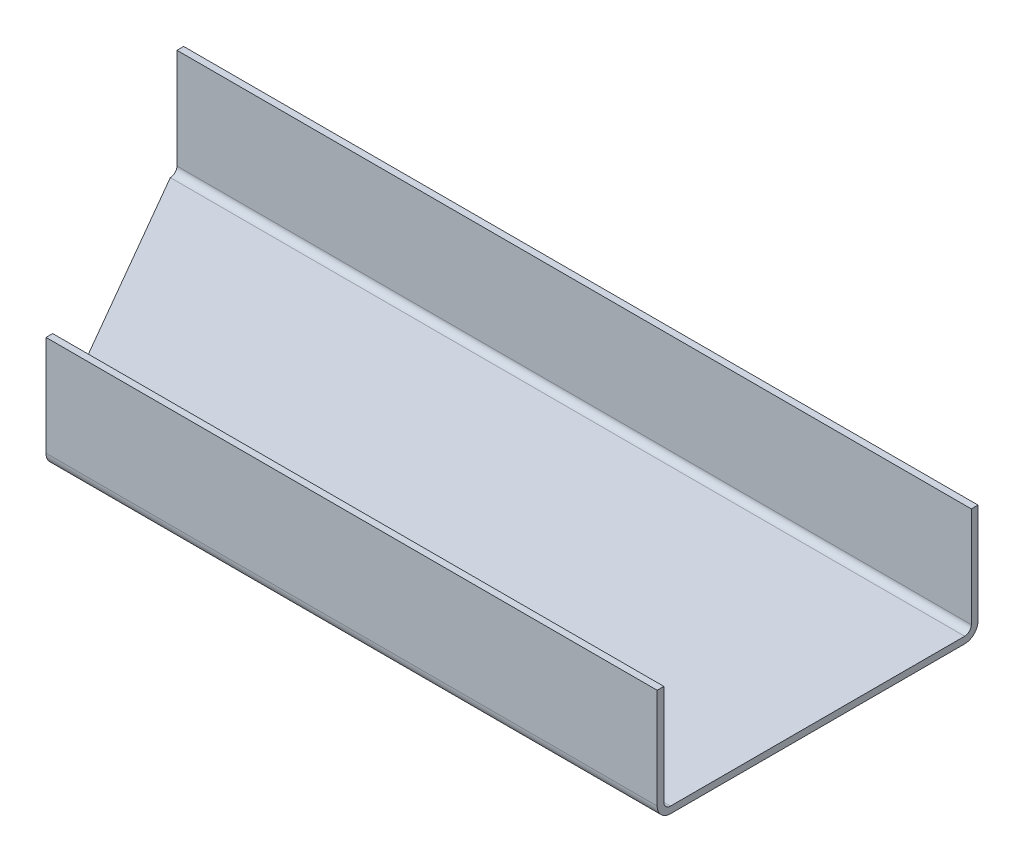
ISO-10303-21;
HEADER;
FILE_DESCRIPTION(('STEP AP214'),'2;1');
FILE_NAME('part.step','',(''),(''),'','','');
FILE_SCHEMA(('AUTOMOTIVE_DESIGN { 1 0 10303 214 1 1 1 1 }'));
ENDSEC;
DATA;
#1=APPLICATION_CONTEXT('core data for automotive mechanical design processes');
#2=APPLICATION_PROTOCOL_DEFINITION('international standard','automotive_design',2000,#1);
#3=PRODUCT_CONTEXT('',#1,'mechanical');
#4=PRODUCT('Part','Part','',(#3));
#5=PRODUCT_RELATED_PRODUCT_CATEGORY('part','',(#4));
#6=PRODUCT_DEFINITION_FORMATION('','',#4);
#7=PRODUCT_DEFINITION_CONTEXT('part definition',#1,'design');
#8=PRODUCT_DEFINITION('design','',#6,#7);
#9=PRODUCT_DEFINITION_SHAPE('','',#8);
#10=(LENGTH_UNIT() NAMED_UNIT(*) SI_UNIT(.MILLI.,.METRE.));
#11=(NAMED_UNIT(*) PLANE_ANGLE_UNIT() SI_UNIT($,.RADIAN.));
#12=(NAMED_UNIT(*) SI_UNIT($,.STERADIAN.) SOLID_ANGLE_UNIT());
#13=UNCERTAINTY_MEASURE_WITH_UNIT(LENGTH_MEASURE(1.E-05),#10,'distance_accuracy_value','');
#14=(GEOMETRIC_REPRESENTATION_CONTEXT(3) GLOBAL_UNCERTAINTY_ASSIGNED_CONTEXT((#13)) GLOBAL_UNIT_ASSIGNED_CONTEXT((#10,
#11,#12)) REPRESENTATION_CONTEXT('',''));
#15=CARTESIAN_POINT('',(0.,0.,0.));
#16=DIRECTION('',(0.,0.,1.));
#17=DIRECTION('',(1.,0.,0.));
#18=AXIS2_PLACEMENT_3D('',#15,#16,#17);
#19=CARTESIAN_POINT('',(-355.901016080212,6.35,0.));
#20=DIRECTION('',(0.,0.,1.));
#21=DIRECTION('',(1.,0.,0.));
#22=AXIS2_PLACEMENT_3D('',#19,#20,#21);
#23=PLANE('',#22);
#24=DIRECTION('',(-1.,0.,0.));
#25=VECTOR('',#24,1.);
#26=CARTESIAN_POINT('',(-355.901016080212,6.35,0.));
#27=LINE('',#26,#25);
#28=CARTESIAN_POINT('',(-733.234841870792,6.35,0.));
#29=VERTEX_POINT('',#28);
#30=CARTESIAN_POINT('',(-355.901016080212,6.35,0.));
#31=VERTEX_POINT('',#30);
#32=EDGE_CURVE('E176',#29,#31,#27,.F.);
#33=ORIENTED_EDGE('',*,*,#32,.F.);
#34=DIRECTION('',(0.,1.,0.));
#35=VECTOR('',#34,1.);
#36=CARTESIAN_POINT('',(-733.234841870792,30.1625,0.));
#37=LINE('',#36,#35);
#38=CARTESIAN_POINT('',(-733.234841870792,53.975,0.));
#39=VERTEX_POINT('',#38);
#40=EDGE_CURVE('E184',#29,#39,#37,.T.);
#41=ORIENTED_EDGE('',*,*,#40,.T.);
#42=DIRECTION('',(1.,0.,0.));
#43=VECTOR('',#42,1.);
#44=CARTESIAN_POINT('',(-544.567928975502,53.975,0.));
#45=LINE('',#44,#43);
#46=CARTESIAN_POINT('',(-355.901016080212,53.975,0.));
#47=VERTEX_POINT('',#46);
#48=EDGE_CURVE('E205',#39,#47,#45,.T.);
#49=ORIENTED_EDGE('',*,*,#48,.T.);
#50=DIRECTION('',(0.,1.,0.));
#51=VECTOR('',#50,1.);
#52=CARTESIAN_POINT('',(-355.901016080212,30.1625,0.));
#53=LINE('',#52,#51);
#54=EDGE_CURVE('E190',#47,#31,#53,.F.);
#55=ORIENTED_EDGE('',*,*,#54,.T.);
#56=EDGE_LOOP('',(#33,#41,#49,#55));
#57=FACE_BOUND('',#56,.T.);
#58=ADVANCED_FACE('F33',(#57),#23,.F.);
#59=CARTESIAN_POINT('',(-646.229009265076,6.35,152.4));
#60=DIRECTION('',(0.,0.,-1.));
#61=DIRECTION('',(-1.,0.,0.));
#62=AXIS2_PLACEMENT_3D('',#59,#60,#61);
#63=PLANE('',#62);
#64=DIRECTION('',(1.,0.,0.));
#65=VECTOR('',#64,1.);
#66=CARTESIAN_POINT('',(-646.229009265076,6.35,152.4));
#67=LINE('',#66,#65);
#68=CARTESIAN_POINT('',(-355.901016080212,6.35,152.4));
#69=VERTEX_POINT('',#68);
#70=CARTESIAN_POINT('',(-646.229009265076,6.35,152.4));
#71=VERTEX_POINT('',#70);
#72=EDGE_CURVE('E174',#69,#71,#67,.F.);
#73=ORIENTED_EDGE('',*,*,#72,.F.);
#74=DIRECTION('',(0.,1.,0.));
#75=VECTOR('',#74,1.);
#76=CARTESIAN_POINT('',(-355.901016080212,30.1625,152.4));
#77=LINE('',#76,#75);
#78=CARTESIAN_POINT('',(-355.901016080212,53.975,152.4));
#79=VERTEX_POINT('',#78);
#80=EDGE_CURVE('E152',#69,#79,#77,.T.);
#81=ORIENTED_EDGE('',*,*,#80,.T.);
#82=DIRECTION('',(1.,0.,0.));
#83=VECTOR('',#82,1.);
#84=CARTESIAN_POINT('',(-501.065012672644,53.975,152.4));
#85=LINE('',#84,#83);
#86=CARTESIAN_POINT('',(-646.229009265076,53.975,152.4));
#87=VERTEX_POINT('',#86);
#88=EDGE_CURVE('E213',#79,#87,#85,.F.);
#89=ORIENTED_EDGE('',*,*,#88,.T.);
#90=DIRECTION('',(0.,1.,0.));
#91=VECTOR('',#90,1.);
#92=CARTESIAN_POINT('',(-646.229009265076,30.1625,152.4));
#93=LINE('',#92,#91);
#94=EDGE_CURVE('E177',#87,#71,#93,.F.);
#95=ORIENTED_EDGE('',*,*,#94,.T.);
#96=EDGE_LOOP('',(#73,#81,#89,#95));
#97=FACE_BOUND('',#96,.T.);
#98=ADVANCED_FACE('F435',(#97),#63,.F.);
#99=CARTESIAN_POINT('',(-501.065012672644,53.975,150.8125));
#100=DIRECTION('',(0.,-1.,0.));
#101=DIRECTION('',(0.,0.,-1.));
#102=AXIS2_PLACEMENT_3D('',#99,#100,#101);
#103=PLANE('',#102);
#104=DIRECTION('',(0.,0.,1.));
#105=VECTOR('',#104,1.);
#106=CARTESIAN_POINT('',(-355.901016080212,53.975,150.8125));
#107=LINE('',#106,#105);
#108=CARTESIAN_POINT('',(-355.901016080212,53.975,149.225));
#109=VERTEX_POINT('',#108);
#110=EDGE_CURVE('E209',#79,#109,#107,.F.);
#111=ORIENTED_EDGE('',*,*,#110,.T.);
#112=DIRECTION('',(-1.,0.,0.));
#113=VECTOR('',#112,1.);
#114=CARTESIAN_POINT('',(-646.229009265076,53.975,149.225));
#115=LINE('',#114,#113);
#116=CARTESIAN_POINT('',(-646.229009265076,53.975,149.225));
#117=VERTEX_POINT('',#116);
#118=EDGE_CURVE('E159',#117,#109,#115,.F.);
#119=ORIENTED_EDGE('',*,*,#118,.F.);
#120=DIRECTION('',(0.,0.,-1.));
#121=VECTOR('',#120,1.);
#122=CARTESIAN_POINT('',(-646.229009265076,53.975,150.8125));
#123=LINE('',#122,#121);
#124=EDGE_CURVE('E179',#117,#87,#123,.F.);
#125=ORIENTED_EDGE('',*,*,#124,.T.);
#126=ORIENTED_EDGE('',*,*,#88,.F.);
#127=EDGE_LOOP('',(#111,#119,#125,#126));
#128=FACE_BOUND('',#127,.T.);
#129=ADVANCED_FACE('F261',(#128),#103,.F.);
#130=CARTESIAN_POINT('',(-544.567928975502,53.975,1.5875));
#131=DIRECTION('',(0.,-1.,0.));
#132=DIRECTION('',(0.,0.,-1.));
#133=AXIS2_PLACEMENT_3D('',#130,#131,#132);
#134=PLANE('',#133);
#135=DIRECTION('',(0.,0.,-1.));
#136=VECTOR('',#135,1.);
#137=CARTESIAN_POINT('',(-733.234841870792,53.975,1.5875));
#138=LINE('',#137,#136);
#139=CARTESIAN_POINT('',(-733.234841870792,53.975,3.175));
#140=VERTEX_POINT('',#139);
#141=EDGE_CURVE('E187',#39,#140,#138,.F.);
#142=ORIENTED_EDGE('',*,*,#141,.T.);
#143=DIRECTION('',(1.,0.,0.));
#144=VECTOR('',#143,1.);
#145=CARTESIAN_POINT('',(-355.901016080212,53.975,3.175));
#146=LINE('',#145,#144);
#147=CARTESIAN_POINT('',(-355.901016080212,53.975,3.175));
#148=VERTEX_POINT('',#147);
#149=EDGE_CURVE('E156',#148,#140,#146,.F.);
#150=ORIENTED_EDGE('',*,*,#149,.F.);
#151=DIRECTION('',(0.,0.,1.));
#152=VECTOR('',#151,1.);
#153=CARTESIAN_POINT('',(-355.901016080212,53.975,1.5875));
#154=LINE('',#153,#152);
#155=EDGE_CURVE('E192',#148,#47,#154,.F.);
#156=ORIENTED_EDGE('',*,*,#155,.T.);
#157=ORIENTED_EDGE('',*,*,#48,.F.);
#158=EDGE_LOOP('',(#142,#150,#156,#157));
#159=FACE_BOUND('',#158,.T.);
#160=ADVANCED_FACE('F300',(#159),#134,.F.);
#161=CARTESIAN_POINT('',(-355.901016080212,6.35,6.35));
#162=DIRECTION('',(-1.,0.,0.));
#163=DIRECTION('',(0.,0.,1.));
#164=AXIS2_PLACEMENT_3D('',#161,#162,#163);
#165=CYLINDRICAL_SURFACE('',#164,6.35);
#166=CARTESIAN_POINT('',(-733.234841870792,6.35,6.35));
#167=DIRECTION('',(-1.,0.,0.));
#168=DIRECTION('',(0.,0.,1.));
#169=AXIS2_PLACEMENT_3D('',#166,#167,#168);
#170=CIRCLE('',#169,6.35);
#171=CARTESIAN_POINT('',(-733.234841870828,0.,6.35000000006234));
#172=VERTEX_POINT('',#171);
#173=EDGE_CURVE('E237',#172,#29,#170,.F.);
#174=ORIENTED_EDGE('',*,*,#173,.T.);
#175=ORIENTED_EDGE('',*,*,#32,.T.);
#176=CARTESIAN_POINT('',(-355.901016080212,6.35,6.35));
#177=DIRECTION('',(-1.,0.,0.));
#178=DIRECTION('',(0.,0.,1.));
#179=AXIS2_PLACEMENT_3D('',#176,#177,#178);
#180=CIRCLE('',#179,6.35);
#181=CARTESIAN_POINT('',(-355.901016080212,0.,6.35));
#182=VERTEX_POINT('',#181);
#183=EDGE_CURVE('E239',#31,#182,#180,.T.);
#184=ORIENTED_EDGE('',*,*,#183,.T.);
#185=DIRECTION('',(1.,0.,0.));
#186=VECTOR('',#185,1.);
#187=CARTESIAN_POINT('',(0.,0.,6.35));
#188=LINE('',#187,#186);
#189=EDGE_CURVE('E136',#182,#172,#188,.F.);
#190=ORIENTED_EDGE('',*,*,#189,.T.);
#191=EDGE_LOOP('',(#174,#175,#184,#190));
#192=FACE_BOUND('',#191,.T.);
#193=ADVANCED_FACE('F413',(#192),#165,.T.);
#194=CARTESIAN_POINT('',(-646.229009265076,6.35,146.05));
#195=DIRECTION('',(1.,0.,0.));
#196=DIRECTION('',(0.,0.,-1.));
#197=AXIS2_PLACEMENT_3D('',#194,#195,#196);
#198=CYLINDRICAL_SURFACE('',#197,6.35);
#199=CARTESIAN_POINT('',(-355.901016080212,6.35,146.05));
#200=DIRECTION('',(1.,0.,0.));
#201=DIRECTION('',(0.,0.,-1.));
#202=AXIS2_PLACEMENT_3D('',#199,#200,#201);
#203=CIRCLE('',#202,6.35);
#204=CARTESIAN_POINT('',(-355.901016080212,0.,146.05));
#205=VERTEX_POINT('',#204);
#206=EDGE_CURVE('E36',#205,#69,#203,.F.);
#207=ORIENTED_EDGE('',*,*,#206,.T.);
#208=ORIENTED_EDGE('',*,*,#72,.T.);
#209=CARTESIAN_POINT('',(-646.229009265076,6.35,146.05));
#210=DIRECTION('',(1.,0.,0.));
#211=DIRECTION('',(0.,0.,-1.));
#212=AXIS2_PLACEMENT_3D('',#209,#210,#211);
#213=CIRCLE('',#212,6.35);
#214=CARTESIAN_POINT('',(-646.229009265076,0.,146.050000000013));
#215=VERTEX_POINT('',#214);
#216=EDGE_CURVE('E132',#71,#215,#213,.T.);
#217=ORIENTED_EDGE('',*,*,#216,.T.);
#218=DIRECTION('',(1.,0.,0.));
#219=VECTOR('',#218,1.);
#220=CARTESIAN_POINT('',(0.,0.,146.05));
#221=LINE('',#220,#219);
#222=EDGE_CURVE('E126',#215,#205,#221,.T.);
#223=ORIENTED_EDGE('',*,*,#222,.T.);
#224=EDGE_LOOP('',(#207,#208,#217,#223));
#225=FACE_BOUND('',#224,.T.);
#226=ADVANCED_FACE('F128',(#225),#198,.T.);
#227=CARTESIAN_POINT('',(-646.229009265076,6.35,149.225));
#228=DIRECTION('',(0.,0.,-1.));
#229=DIRECTION('',(-1.,0.,0.));
#230=AXIS2_PLACEMENT_3D('',#227,#228,#229);
#231=PLANE('',#230);
#232=DIRECTION('',(0.,1.,0.));
#233=VECTOR('',#232,1.);
#234=CARTESIAN_POINT('',(-355.901016080212,6.35,149.225));
#235=LINE('',#234,#233);
#236=CARTESIAN_POINT('',(-355.901016080212,6.35,149.225));
#237=VERTEX_POINT('',#236);
#238=EDGE_CURVE('E154',#109,#237,#235,.F.);
#239=ORIENTED_EDGE('',*,*,#238,.T.);
#240=DIRECTION('',(1.,0.,0.));
#241=VECTOR('',#240,1.);
#242=CARTESIAN_POINT('',(-646.229009265076,6.35,149.225));
#243=LINE('',#242,#241);
#244=CARTESIAN_POINT('',(-646.229009265076,6.35,149.225));
#245=VERTEX_POINT('',#244);
#246=EDGE_CURVE('E234',#237,#245,#243,.F.);
#247=ORIENTED_EDGE('',*,*,#246,.T.);
#248=DIRECTION('',(0.,1.,0.));
#249=VECTOR('',#248,1.);
#250=CARTESIAN_POINT('',(-646.229009265076,6.35,149.225));
#251=LINE('',#250,#249);
#252=EDGE_CURVE('E166',#245,#117,#251,.T.);
#253=ORIENTED_EDGE('',*,*,#252,.T.);
#254=ORIENTED_EDGE('',*,*,#118,.T.);
#255=EDGE_LOOP('',(#239,#247,#253,#254));
#256=FACE_BOUND('',#255,.T.);
#257=ADVANCED_FACE('F253',(#256),#231,.T.);
#258=CARTESIAN_POINT('',(-355.901016080212,6.35,3.175));
#259=DIRECTION('',(0.,0.,1.));
#260=DIRECTION('',(1.,0.,0.));
#261=AXIS2_PLACEMENT_3D('',#258,#259,#260);
#262=PLANE('',#261);
#263=DIRECTION('',(0.,1.,0.));
#264=VECTOR('',#263,1.);
#265=CARTESIAN_POINT('',(-733.234841870792,6.35,3.175));
#266=LINE('',#265,#264);
#267=CARTESIAN_POINT('',(-733.234841870792,6.35,3.175));
#268=VERTEX_POINT('',#267);
#269=EDGE_CURVE('E200',#140,#268,#266,.F.);
#270=ORIENTED_EDGE('',*,*,#269,.T.);
#271=DIRECTION('',(-1.,0.,0.));
#272=VECTOR('',#271,1.);
#273=CARTESIAN_POINT('',(-355.901016080212,6.35,3.175));
#274=LINE('',#273,#272);
#275=CARTESIAN_POINT('',(-355.901016080212,6.35,3.175));
#276=VERTEX_POINT('',#275);
#277=EDGE_CURVE('E231',#268,#276,#274,.F.);
#278=ORIENTED_EDGE('',*,*,#277,.T.);
#279=DIRECTION('',(0.,1.,0.));
#280=VECTOR('',#279,1.);
#281=CARTESIAN_POINT('',(-355.901016080212,6.35,3.175));
#282=LINE('',#281,#280);
#283=EDGE_CURVE('E153',#276,#148,#282,.T.);
#284=ORIENTED_EDGE('',*,*,#283,.T.);
#285=ORIENTED_EDGE('',*,*,#149,.T.);
#286=EDGE_LOOP('',(#270,#278,#284,#285));
#287=FACE_BOUND('',#286,.T.);
#288=ADVANCED_FACE('F293',(#287),#262,.T.);
#289=CARTESIAN_POINT('',(-733.234841870792,2.9824039545985,2.9824039545985));
#290=DIRECTION('',(1.,0.,0.));
#291=DIRECTION('',(0.,0.,-1.));
#292=AXIS2_PLACEMENT_3D('',#289,#290,#291);
#293=PLANE('',#292);
#294=DIRECTION('',(0.,1.,0.));
#295=VECTOR('',#294,1.);
#296=CARTESIAN_POINT('',(-733.234841870843,1.5875,6.3500000000369));
#297=LINE('',#296,#295);
#298=CARTESIAN_POINT('',(-733.234841870817,3.175,6.35000000002767));
#299=VERTEX_POINT('',#298);
#300=EDGE_CURVE('E287',#172,#299,#297,.T.);
#301=ORIENTED_EDGE('',*,*,#300,.T.);
#302=CARTESIAN_POINT('',(-733.234841870792,6.35,6.35));
#303=DIRECTION('',(-1.,0.,0.));
#304=DIRECTION('',(0.,0.,1.));
#305=AXIS2_PLACEMENT_3D('',#302,#303,#304);
#306=CIRCLE('',#305,3.175);
#307=EDGE_CURVE('E145',#299,#268,#306,.F.);
#308=ORIENTED_EDGE('',*,*,#307,.T.);
#309=ORIENTED_EDGE('',*,*,#269,.F.);
#310=ORIENTED_EDGE('',*,*,#141,.F.);
#311=ORIENTED_EDGE('',*,*,#40,.F.);
#312=ORIENTED_EDGE('',*,*,#173,.F.);
#313=EDGE_LOOP('',(#301,#308,#309,#310,#311,#312));
#314=FACE_BOUND('',#313,.T.);
#315=ADVANCED_FACE('F304',(#314),#293,.F.);
#316=CARTESIAN_POINT('',(-646.229009265076,2.9824039545985,149.417596045414));
#317=DIRECTION('',(1.,0.,0.));
#318=DIRECTION('',(0.,0.,-1.));
#319=AXIS2_PLACEMENT_3D('',#316,#317,#318);
#320=PLANE('',#319);
#321=ORIENTED_EDGE('',*,*,#216,.F.);
#322=ORIENTED_EDGE('',*,*,#94,.F.);
#323=ORIENTED_EDGE('',*,*,#124,.F.);
#324=ORIENTED_EDGE('',*,*,#252,.F.);
#325=CARTESIAN_POINT('',(-646.229009265076,6.35,146.05));
#326=DIRECTION('',(1.,0.,0.));
#327=DIRECTION('',(0.,0.,-1.));
#328=AXIS2_PLACEMENT_3D('',#325,#326,#327);
#329=CIRCLE('',#328,3.175);
#330=CARTESIAN_POINT('',(-646.229009265076,3.175,146.050000000013));
#331=VERTEX_POINT('',#330);
#332=EDGE_CURVE('E146',#245,#331,#329,.T.);
#333=ORIENTED_EDGE('',*,*,#332,.T.);
#334=DIRECTION('',(0.,1.,0.));
#335=VECTOR('',#334,1.);
#336=CARTESIAN_POINT('',(-646.229009265076,1.5875,146.050000000025));
#337=LINE('',#336,#335);
#338=EDGE_CURVE('E271',#331,#215,#337,.F.);
#339=ORIENTED_EDGE('',*,*,#338,.T.);
#340=EDGE_LOOP('',(#321,#322,#323,#324,#333,#339));
#341=FACE_BOUND('',#340,.T.);
#342=ADVANCED_FACE('F257',(#341),#320,.F.);
#343=CARTESIAN_POINT('',(0.,0.,0.));
#344=DIRECTION('',(0.,1.,0.));
#345=DIRECTION('',(0.,0.,1.));
#346=AXIS2_PLACEMENT_3D('',#343,#344,#345);
#347=PLANE('',#346);
#348=DIRECTION('',(-1.,0.,0.));
#349=VECTOR('',#348,1.);
#350=CARTESIAN_POINT('',(-649.404009265076,0.,146.050000000025));
#351=LINE('',#350,#349);
#352=CARTESIAN_POINT('',(-652.579009265071,0.,146.050000000022));
#353=VERTEX_POINT('',#352);
#354=EDGE_CURVE('E277',#215,#353,#351,.T.);
#355=ORIENTED_EDGE('',*,*,#354,.T.);
#356=DIRECTION('',(-0.500000000000017,0.,-0.866025403784429));
#357=VECTOR('',#356,1.);
#358=CARTESIAN_POINT('',(-694.740012672644,0.,73.025));
#359=LINE('',#358,#357);
#360=EDGE_CURVE('E230',#353,#172,#359,.T.);
#361=ORIENTED_EDGE('',*,*,#360,.T.);
#362=ORIENTED_EDGE('',*,*,#189,.F.);
#363=DIRECTION('',(0.,0.,1.));
#364=VECTOR('',#363,1.);
#365=CARTESIAN_POINT('',(-355.901016080212,0.,76.2));
#366=LINE('',#365,#364);
#367=EDGE_CURVE('E140',#182,#205,#366,.T.);
#368=ORIENTED_EDGE('',*,*,#367,.T.);
#369=ORIENTED_EDGE('',*,*,#222,.F.);
#370=EDGE_LOOP('',(#355,#361,#362,#368,#369));
#371=FACE_BOUND('',#370,.T.);
#372=ADVANCED_FACE('F141',(#371),#347,.F.);
#373=CARTESIAN_POINT('',(-646.229009265076,6.35,146.05));
#374=DIRECTION('',(1.,0.,0.));
#375=DIRECTION('',(0.,0.,-1.));
#376=AXIS2_PLACEMENT_3D('',#373,#374,#375);
#377=CYLINDRICAL_SURFACE('',#376,3.175);
#378=ORIENTED_EDGE('',*,*,#246,.F.);
#379=CARTESIAN_POINT('',(-355.901016080212,6.35,146.05));
#380=DIRECTION('',(1.,0.,0.));
#381=DIRECTION('',(0.,0.,-1.));
#382=AXIS2_PLACEMENT_3D('',#379,#380,#381);
#383=CIRCLE('',#382,3.175);
#384=CARTESIAN_POINT('',(-355.901016080212,3.175,146.05));
#385=VERTEX_POINT('',#384);
#386=EDGE_CURVE('E135',#385,#237,#383,.F.);
#387=ORIENTED_EDGE('',*,*,#386,.F.);
#388=DIRECTION('',(1.,0.,0.));
#389=VECTOR('',#388,1.);
#390=CARTESIAN_POINT('',(0.,3.175,146.05));
#391=LINE('',#390,#389);
#392=EDGE_CURVE('E268',#331,#385,#391,.T.);
#393=ORIENTED_EDGE('',*,*,#392,.F.);
#394=ORIENTED_EDGE('',*,*,#332,.F.);
#395=EDGE_LOOP('',(#378,#387,#393,#394));
#396=FACE_BOUND('',#395,.T.);
#397=ADVANCED_FACE('F267',(#396),#377,.F.);
#398=CARTESIAN_POINT('',(-355.901016080212,1.5875,76.2));
#399=DIRECTION('',(-1.,0.,0.));
#400=DIRECTION('',(0.,0.,1.));
#401=AXIS2_PLACEMENT_3D('',#398,#399,#400);
#402=PLANE('',#401);
#403=CARTESIAN_POINT('',(-355.901016080212,6.35,6.35));
#404=DIRECTION('',(-1.,0.,0.));
#405=DIRECTION('',(0.,0.,1.));
#406=AXIS2_PLACEMENT_3D('',#403,#404,#405);
#407=CIRCLE('',#406,3.175);
#408=CARTESIAN_POINT('',(-355.901016080212,3.175,6.35));
#409=VERTEX_POINT('',#408);
#410=EDGE_CURVE('E228',#276,#409,#407,.T.);
#411=ORIENTED_EDGE('',*,*,#410,.T.);
#412=DIRECTION('',(0.,0.,1.));
#413=VECTOR('',#412,1.);
#414=CARTESIAN_POINT('',(-355.901016080212,3.175,0.));
#415=LINE('',#414,#413);
#416=EDGE_CURVE('E264',#385,#409,#415,.F.);
#417=ORIENTED_EDGE('',*,*,#416,.F.);
#418=ORIENTED_EDGE('',*,*,#386,.T.);
#419=ORIENTED_EDGE('',*,*,#238,.F.);
#420=ORIENTED_EDGE('',*,*,#110,.F.);
#421=ORIENTED_EDGE('',*,*,#80,.F.);
#422=ORIENTED_EDGE('',*,*,#206,.F.);
#423=ORIENTED_EDGE('',*,*,#367,.F.);
#424=ORIENTED_EDGE('',*,*,#183,.F.);
#425=ORIENTED_EDGE('',*,*,#54,.F.);
#426=ORIENTED_EDGE('',*,*,#155,.F.);
#427=ORIENTED_EDGE('',*,*,#283,.F.);
#428=EDGE_LOOP('',(#411,#417,#418,#419,#420,#421,#422,#423,#424,#425,#426,#427));
#429=FACE_BOUND('',#428,.T.);
#430=ADVANCED_FACE('F149',(#429),#402,.F.);
#431=CARTESIAN_POINT('',(-355.901016080212,6.35,6.35));
#432=DIRECTION('',(-1.,0.,0.));
#433=DIRECTION('',(0.,0.,1.));
#434=AXIS2_PLACEMENT_3D('',#431,#432,#433);
#435=CYLINDRICAL_SURFACE('',#434,3.175);
#436=ORIENTED_EDGE('',*,*,#277,.F.);
#437=ORIENTED_EDGE('',*,*,#307,.F.);
#438=DIRECTION('',(1.,0.,0.));
#439=VECTOR('',#438,1.);
#440=CARTESIAN_POINT('',(0.,3.175,6.35));
#441=LINE('',#440,#439);
#442=EDGE_CURVE('E282',#409,#299,#441,.F.);
#443=ORIENTED_EDGE('',*,*,#442,.F.);
#444=ORIENTED_EDGE('',*,*,#410,.F.);
#445=EDGE_LOOP('',(#436,#437,#443,#444));
#446=FACE_BOUND('',#445,.T.);
#447=ADVANCED_FACE('F296',(#446),#435,.F.);
#448=CARTESIAN_POINT('',(-694.740012672644,1.5875,73.025));
#449=DIRECTION('',(0.866025403784429,0.,-0.500000000000017));
#450=DIRECTION('',(-0.500000000000017,0.,-0.866025403784429));
#451=AXIS2_PLACEMENT_3D('',#448,#449,#450);
#452=PLANE('',#451);
#453=ORIENTED_EDGE('',*,*,#360,.F.);
#454=DIRECTION('',(0.,1.,0.));
#455=VECTOR('',#454,1.);
#456=CARTESIAN_POINT('',(-652.579009265076,1.5875,146.050000000025));
#457=LINE('',#456,#455);
#458=CARTESIAN_POINT('',(-652.579009265068,3.175,146.050000000021));
#459=VERTEX_POINT('',#458);
#460=EDGE_CURVE('E51',#353,#459,#457,.T.);
#461=ORIENTED_EDGE('',*,*,#460,.T.);
#462=DIRECTION('',(0.499999999999605,0.,0.866025403784667));
#463=VECTOR('',#462,1.);
#464=CARTESIAN_POINT('',(-733.234841870792,3.175,6.35000000000762));
#465=LINE('',#464,#463);
#466=EDGE_CURVE('E42',#299,#459,#465,.T.);
#467=ORIENTED_EDGE('',*,*,#466,.F.);
#468=ORIENTED_EDGE('',*,*,#300,.F.);
#469=EDGE_LOOP('',(#453,#461,#467,#468));
#470=FACE_BOUND('',#469,.T.);
#471=ADVANCED_FACE('F314',(#470),#452,.F.);
#472=CARTESIAN_POINT('',(-649.404009265076,1.5875,146.050000000025));
#473=DIRECTION('',(0.,0.,-1.));
#474=DIRECTION('',(-1.,0.,0.));
#475=AXIS2_PLACEMENT_3D('',#472,#473,#474);
#476=PLANE('',#475);
#477=DIRECTION('',(1.,0.,0.));
#478=VECTOR('',#477,1.);
#479=CARTESIAN_POINT('',(0.,3.175,146.050000000025));
#480=LINE('',#479,#478);
#481=EDGE_CURVE('E11',#459,#331,#480,.T.);
#482=ORIENTED_EDGE('',*,*,#481,.F.);
#483=ORIENTED_EDGE('',*,*,#460,.F.);
#484=ORIENTED_EDGE('',*,*,#354,.F.);
#485=ORIENTED_EDGE('',*,*,#338,.F.);
#486=EDGE_LOOP('',(#482,#483,#484,#485));
#487=FACE_BOUND('',#486,.T.);
#488=ADVANCED_FACE('F275',(#487),#476,.F.);
#489=CARTESIAN_POINT('',(0.,3.175,0.));
#490=DIRECTION('',(0.,1.,0.));
#491=DIRECTION('',(0.,0.,1.));
#492=AXIS2_PLACEMENT_3D('',#489,#490,#491);
#493=PLANE('',#492);
#494=ORIENTED_EDGE('',*,*,#466,.T.);
#495=ORIENTED_EDGE('',*,*,#481,.T.);
#496=ORIENTED_EDGE('',*,*,#392,.T.);
#497=ORIENTED_EDGE('',*,*,#416,.T.);
#498=ORIENTED_EDGE('',*,*,#442,.T.);
#499=EDGE_LOOP('',(#494,#495,#496,#497,#498));
#500=FACE_BOUND('',#499,.T.);
#501=ADVANCED_FACE('F279',(#500),#493,.T.);
#502=CLOSED_SHELL('',(#58,#98,#129,#160,#193,#226,#257,#288,#315,#342,#372,#397,#430,#447,#471,
#488,#501));
#503=MANIFOLD_SOLID_BREP('B2',#502);
#504=ADVANCED_BREP_SHAPE_REPRESENTATION('',(#18,#503),#14);
#505=SHAPE_DEFINITION_REPRESENTATION(#9,#504);
ENDSEC;
END-ISO-10303-21;
